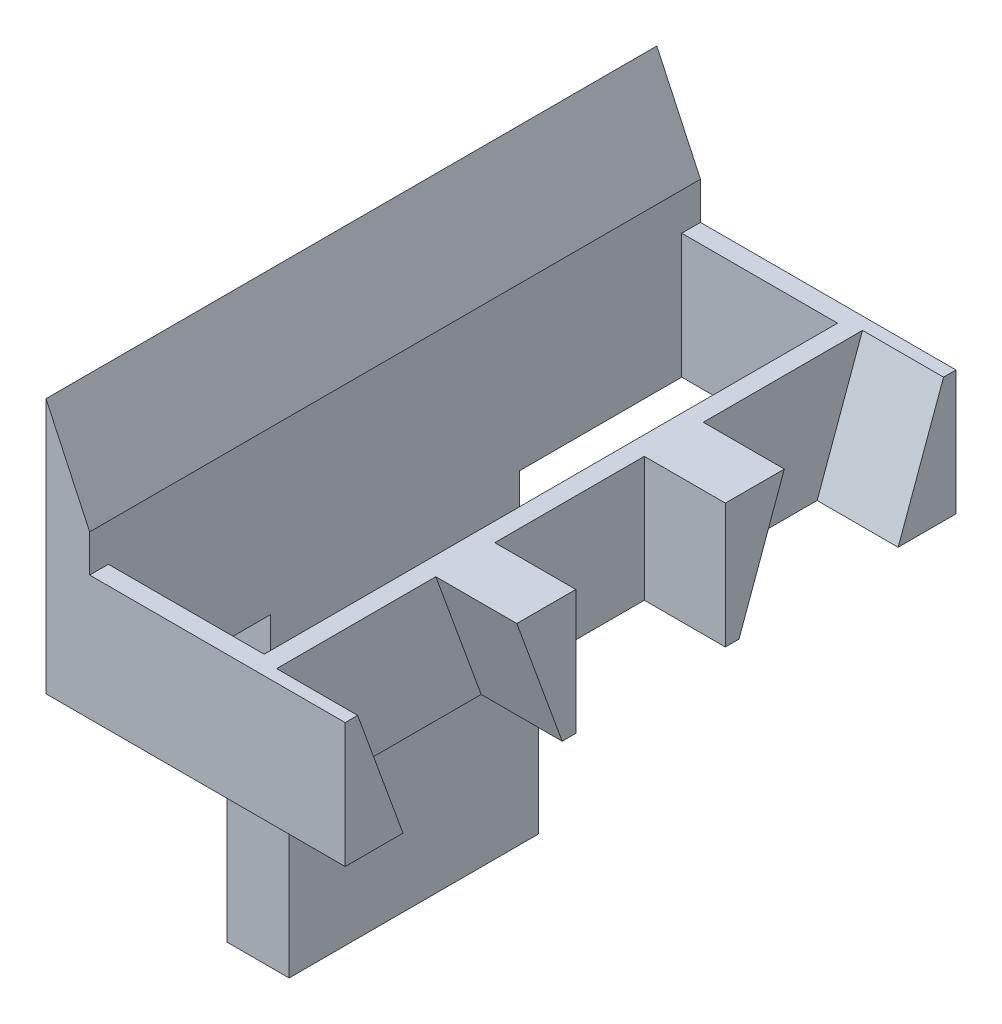
ISO-10303-21;
HEADER;
FILE_DESCRIPTION(('STEP AP214'),'2;1');
FILE_NAME('part.step','',(''),(''),'','','');
FILE_SCHEMA(('AUTOMOTIVE_DESIGN { 1 0 10303 214 1 1 1 1 }'));
ENDSEC;
DATA;
#1=APPLICATION_CONTEXT('core data for automotive mechanical design processes');
#2=APPLICATION_PROTOCOL_DEFINITION('international standard','automotive_design',2000,#1);
#3=PRODUCT_CONTEXT('',#1,'mechanical');
#4=PRODUCT('Part','Part','',(#3));
#5=PRODUCT_RELATED_PRODUCT_CATEGORY('part','',(#4));
#6=PRODUCT_DEFINITION_FORMATION('','',#4);
#7=PRODUCT_DEFINITION_CONTEXT('part definition',#1,'design');
#8=PRODUCT_DEFINITION('design','',#6,#7);
#9=PRODUCT_DEFINITION_SHAPE('','',#8);
#10=(LENGTH_UNIT() NAMED_UNIT(*) SI_UNIT(.MILLI.,.METRE.));
#11=(NAMED_UNIT(*) PLANE_ANGLE_UNIT() SI_UNIT($,.RADIAN.));
#12=(NAMED_UNIT(*) SI_UNIT($,.STERADIAN.) SOLID_ANGLE_UNIT());
#13=UNCERTAINTY_MEASURE_WITH_UNIT(LENGTH_MEASURE(1.E-05),#10,'distance_accuracy_value','');
#14=(GEOMETRIC_REPRESENTATION_CONTEXT(3) GLOBAL_UNCERTAINTY_ASSIGNED_CONTEXT((#13)) GLOBAL_UNIT_ASSIGNED_CONTEXT((#10,
#11,#12)) REPRESENTATION_CONTEXT('',''));
#15=CARTESIAN_POINT('',(0.,0.,0.));
#16=DIRECTION('',(0.,0.,1.));
#17=DIRECTION('',(1.,0.,0.));
#18=AXIS2_PLACEMENT_3D('',#15,#16,#17);
#19=CARTESIAN_POINT('',(0.,0.,49.));
#20=DIRECTION('',(-1.,0.,0.));
#21=DIRECTION('',(0.,-1.,0.));
#22=AXIS2_PLACEMENT_3D('',#19,#20,#21);
#23=PLANE('',#22);
#24=DIRECTION('',(0.,0.,1.));
#25=VECTOR('',#24,1.);
#26=CARTESIAN_POINT('',(0.,16.5,34.5));
#27=LINE('',#26,#25);
#28=CARTESIAN_POINT('',(0.,16.5,14.5));
#29=VERTEX_POINT('',#28);
#30=CARTESIAN_POINT('',(0.,16.5,34.5));
#31=VERTEX_POINT('',#30);
#32=EDGE_CURVE('E251',#29,#31,#27,.T.);
#33=ORIENTED_EDGE('',*,*,#32,.F.);
#34=DIRECTION('',(0.,-1.,0.));
#35=VECTOR('',#34,1.);
#36=CARTESIAN_POINT('',(0.,4.5,14.5));
#37=LINE('',#36,#35);
#38=CARTESIAN_POINT('',(0.,28.9942257782166,14.5));
#39=VERTEX_POINT('',#38);
#40=EDGE_CURVE('E401',#39,#29,#37,.T.);
#41=ORIENTED_EDGE('',*,*,#40,.F.);
#42=DIRECTION('',(0.,0.,1.));
#43=VECTOR('',#42,1.);
#44=CARTESIAN_POINT('',(0.,28.9942257782166,0.));
#45=LINE('',#44,#43);
#46=CARTESIAN_POINT('',(0.,28.9942257782166,1.5));
#47=VERTEX_POINT('',#46);
#48=EDGE_CURVE('E373',#47,#39,#45,.T.);
#49=ORIENTED_EDGE('',*,*,#48,.F.);
#50=DIRECTION('',(0.,-1.,0.));
#51=VECTOR('',#50,1.);
#52=CARTESIAN_POINT('',(0.,38.9942257782166,1.5));
#53=LINE('',#52,#51);
#54=CARTESIAN_POINT('',(0.,38.9942257782166,1.5));
#55=VERTEX_POINT('',#54);
#56=EDGE_CURVE('E377',#55,#47,#53,.T.);
#57=ORIENTED_EDGE('',*,*,#56,.F.);
#58=DIRECTION('',(0.,0.,-1.));
#59=VECTOR('',#58,1.);
#60=CARTESIAN_POINT('',(0.,38.9942257782166,1.5));
#61=LINE('',#60,#59);
#62=CARTESIAN_POINT('',(0.,38.9942257782166,0.));
#63=VERTEX_POINT('',#62);
#64=EDGE_CURVE('E344',#55,#63,#61,.T.);
#65=ORIENTED_EDGE('',*,*,#64,.T.);
#66=DIRECTION('',(0.,1.,0.));
#67=VECTOR('',#66,1.);
#68=CARTESIAN_POINT('',(0.,0.,0.));
#69=LINE('',#68,#67);
#70=CARTESIAN_POINT('',(0.,41.9942257782166,0.));
#71=VERTEX_POINT('',#70);
#72=EDGE_CURVE('E423',#63,#71,#69,.T.);
#73=ORIENTED_EDGE('',*,*,#72,.T.);
#74=DIRECTION('',(0.,0.,-1.));
#75=VECTOR('',#74,1.);
#76=CARTESIAN_POINT('',(0.,41.9942257782166,49.));
#77=LINE('',#76,#75);
#78=CARTESIAN_POINT('',(0.,41.9942257782166,49.));
#79=VERTEX_POINT('',#78);
#80=EDGE_CURVE('E47',#79,#71,#77,.T.);
#81=ORIENTED_EDGE('',*,*,#80,.F.);
#82=DIRECTION('',(0.,1.,0.));
#83=VECTOR('',#82,1.);
#84=CARTESIAN_POINT('',(0.,0.,49.));
#85=LINE('',#84,#83);
#86=CARTESIAN_POINT('',(0.,38.9942257782166,49.));
#87=VERTEX_POINT('',#86);
#88=EDGE_CURVE('E426',#87,#79,#85,.T.);
#89=ORIENTED_EDGE('',*,*,#88,.F.);
#90=DIRECTION('',(0.,0.,-1.));
#91=VECTOR('',#90,1.);
#92=CARTESIAN_POINT('',(0.,38.9942257782166,47.5));
#93=LINE('',#92,#91);
#94=CARTESIAN_POINT('',(0.,38.9942257782166,47.5));
#95=VERTEX_POINT('',#94);
#96=EDGE_CURVE('E331',#87,#95,#93,.T.);
#97=ORIENTED_EDGE('',*,*,#96,.T.);
#98=DIRECTION('',(0.,-1.,0.));
#99=VECTOR('',#98,1.);
#100=CARTESIAN_POINT('',(0.,38.9942257782166,47.5));
#101=LINE('',#100,#99);
#102=CARTESIAN_POINT('',(0.,28.9942257782166,47.5));
#103=VERTEX_POINT('',#102);
#104=EDGE_CURVE('E358',#95,#103,#101,.T.);
#105=ORIENTED_EDGE('',*,*,#104,.T.);
#106=DIRECTION('',(0.,0.,1.));
#107=VECTOR('',#106,1.);
#108=CARTESIAN_POINT('',(0.,28.9942257782166,49.));
#109=LINE('',#108,#107);
#110=CARTESIAN_POINT('',(0.,28.9942257782166,34.5));
#111=VERTEX_POINT('',#110);
#112=EDGE_CURVE('E390',#111,#103,#109,.T.);
#113=ORIENTED_EDGE('',*,*,#112,.F.);
#114=DIRECTION('',(0.,1.,0.));
#115=VECTOR('',#114,1.);
#116=CARTESIAN_POINT('',(0.,4.5,34.5));
#117=LINE('',#116,#115);
#118=EDGE_CURVE('E404',#31,#111,#117,.T.);
#119=ORIENTED_EDGE('',*,*,#118,.F.);
#120=EDGE_LOOP('',(#33,#41,#49,#57,#65,#73,#81,#89,#97,#105,#113,#119));
#121=FACE_BOUND('',#120,.T.);
#122=ADVANCED_FACE('F39',(#121),#23,.F.);
#123=CARTESIAN_POINT('',(20.5,38.9942257782166,49.));
#124=DIRECTION('',(1.,0.,0.));
#125=DIRECTION('',(0.,0.,-1.));
#126=AXIS2_PLACEMENT_3D('',#123,#124,#125);
#127=PLANE('',#126);
#128=DIRECTION('',(0.,0.939692620785908,0.342020143325669));
#129=VECTOR('',#128,1.);
#130=CARTESIAN_POINT('',(20.5,38.9942257782166,35.2298667302891));
#131=LINE('',#130,#129);
#132=CARTESIAN_POINT('',(20.5,28.9942257782166,31.590164387627));
#133=VERTEX_POINT('',#132);
#134=CARTESIAN_POINT('',(20.5,38.9942257782166,35.2298667302891));
#135=VERTEX_POINT('',#134);
#136=EDGE_CURVE('E265',#133,#135,#131,.T.);
#137=ORIENTED_EDGE('',*,*,#136,.F.);
#138=DIRECTION('',(0.,0.,1.));
#139=VECTOR('',#138,1.);
#140=CARTESIAN_POINT('',(20.5,28.9942257782166,49.));
#141=LINE('',#140,#139);
#142=CARTESIAN_POINT('',(20.5,28.9942257782166,30.5));
#143=VERTEX_POINT('',#142);
#144=EDGE_CURVE('E543',#143,#133,#141,.T.);
#145=ORIENTED_EDGE('',*,*,#144,.F.);
#146=DIRECTION('',(0.,-1.,0.));
#147=VECTOR('',#146,1.);
#148=CARTESIAN_POINT('',(20.5,28.9942257782166,30.5));
#149=LINE('',#148,#147);
#150=CARTESIAN_POINT('',(20.5,38.9942257782166,30.5));
#151=VERTEX_POINT('',#150);
#152=EDGE_CURVE('E298',#151,#143,#149,.T.);
#153=ORIENTED_EDGE('',*,*,#152,.F.);
#154=DIRECTION('',(0.,0.,1.));
#155=VECTOR('',#154,1.);
#156=CARTESIAN_POINT('',(20.5,38.9942257782166,49.));
#157=LINE('',#156,#155);
#158=EDGE_CURVE('E549',#151,#135,#157,.T.);
#159=ORIENTED_EDGE('',*,*,#158,.T.);
#160=EDGE_LOOP('',(#137,#145,#153,#159));
#161=FACE_BOUND('',#160,.T.);
#162=ADVANCED_FACE('F491',(#161),#127,.T.);
#163=DIRECTION('',(0.,1.,0.));
#164=VECTOR('',#163,1.);
#165=CARTESIAN_POINT('',(20.5,28.9942257782166,18.5));
#166=LINE('',#165,#164);
#167=CARTESIAN_POINT('',(20.5,28.9942257782166,18.5));
#168=VERTEX_POINT('',#167);
#169=CARTESIAN_POINT('',(20.5,38.9942257782166,18.5));
#170=VERTEX_POINT('',#169);
#171=EDGE_CURVE('E274',#168,#170,#166,.T.);
#172=ORIENTED_EDGE('',*,*,#171,.F.);
#173=CARTESIAN_POINT('',(20.5,28.9942257782166,17.409835612373));
#174=VERTEX_POINT('',#173);
#175=EDGE_CURVE('E369',#174,#168,#141,.T.);
#176=ORIENTED_EDGE('',*,*,#175,.F.);
#177=DIRECTION('',(0.,-0.939692620785908,0.342020143325669));
#178=VECTOR('',#177,1.);
#179=CARTESIAN_POINT('',(20.5,38.9942257782166,13.7701332697109));
#180=LINE('',#179,#178);
#181=CARTESIAN_POINT('',(20.5,38.9942257782166,13.7701332697109));
#182=VERTEX_POINT('',#181);
#183=EDGE_CURVE('E297',#182,#174,#180,.T.);
#184=ORIENTED_EDGE('',*,*,#183,.F.);
#185=EDGE_CURVE('E355',#182,#170,#157,.T.);
#186=ORIENTED_EDGE('',*,*,#185,.T.);
#187=EDGE_LOOP('',(#172,#176,#184,#186));
#188=FACE_BOUND('',#187,.T.);
#189=ADVANCED_FACE('F496',(#188),#127,.T.);
#190=DIRECTION('',(0.,-0.939692620785908,-0.34202014332567));
#191=VECTOR('',#190,1.);
#192=CARTESIAN_POINT('',(20.5,38.9942257782166,48.));
#193=LINE('',#192,#191);
#194=CARTESIAN_POINT('',(20.5,38.9942257782166,48.));
#195=VERTEX_POINT('',#194);
#196=CARTESIAN_POINT('',(20.5,28.9942257782166,44.360297657338));
#197=VERTEX_POINT('',#196);
#198=EDGE_CURVE('E272',#195,#197,#193,.T.);
#199=ORIENTED_EDGE('',*,*,#198,.F.);
#200=CARTESIAN_POINT('',(20.5,38.9942257782166,49.));
#201=VERTEX_POINT('',#200);
#202=EDGE_CURVE('E350',#195,#201,#157,.T.);
#203=ORIENTED_EDGE('',*,*,#202,.T.);
#204=DIRECTION('',(0.,-1.,0.));
#205=VECTOR('',#204,1.);
#206=CARTESIAN_POINT('',(20.5,38.9942257782166,49.));
#207=LINE('',#206,#205);
#208=CARTESIAN_POINT('',(20.5,28.9942257782166,49.));
#209=VERTEX_POINT('',#208);
#210=EDGE_CURVE('E370',#201,#209,#207,.T.);
#211=ORIENTED_EDGE('',*,*,#210,.T.);
#212=EDGE_CURVE('E366',#197,#209,#141,.T.);
#213=ORIENTED_EDGE('',*,*,#212,.F.);
#214=EDGE_LOOP('',(#199,#203,#211,#213));
#215=FACE_BOUND('',#214,.T.);
#216=ADVANCED_FACE('F506',(#215),#127,.T.);
#217=CARTESIAN_POINT('',(0.,41.9942257782166,49.));
#218=DIRECTION('',(-0.906307787036649,-0.422618261740701,0.));
#219=DIRECTION('',(0.422618261740701,-0.906307787036649,0.));
#220=AXIS2_PLACEMENT_3D('',#217,#218,#219);
#221=PLANE('',#220);
#222=DIRECTION('',(-0.422618261740701,0.906307787036649,0.));
#223=VECTOR('',#222,1.);
#224=CARTESIAN_POINT('',(0.,41.9942257782166,0.));
#225=LINE('',#224,#223);
#226=CARTESIAN_POINT('',(-3.5,49.5,0.));
#227=VERTEX_POINT('',#226);
#228=EDGE_CURVE('E411',#71,#227,#225,.T.);
#229=ORIENTED_EDGE('',*,*,#228,.T.);
#230=DIRECTION('',(0.,0.,-1.));
#231=VECTOR('',#230,1.);
#232=CARTESIAN_POINT('',(-3.5,49.5,49.));
#233=LINE('',#232,#231);
#234=CARTESIAN_POINT('',(-3.5,49.5,49.));
#235=VERTEX_POINT('',#234);
#236=EDGE_CURVE('E11',#235,#227,#233,.T.);
#237=ORIENTED_EDGE('',*,*,#236,.F.);
#238=DIRECTION('',(-0.422618261740701,0.906307787036649,0.));
#239=VECTOR('',#238,1.);
#240=CARTESIAN_POINT('',(0.,41.9942257782166,49.));
#241=LINE('',#240,#239);
#242=EDGE_CURVE('E419',#79,#235,#241,.T.);
#243=ORIENTED_EDGE('',*,*,#242,.F.);
#244=ORIENTED_EDGE('',*,*,#80,.T.);
#245=EDGE_LOOP('',(#229,#237,#243,#244));
#246=FACE_BOUND('',#245,.T.);
#247=ADVANCED_FACE('F41',(#246),#221,.F.);
#248=CARTESIAN_POINT('',(-3.5,49.5,49.));
#249=DIRECTION('',(1.,0.,0.));
#250=DIRECTION('',(0.,1.,0.));
#251=AXIS2_PLACEMENT_3D('',#248,#249,#250);
#252=PLANE('',#251);
#253=DIRECTION('',(0.,1.,0.));
#254=VECTOR('',#253,1.);
#255=CARTESIAN_POINT('',(-3.5,4.5,34.5));
#256=LINE('',#255,#254);
#257=CARTESIAN_POINT('',(-3.5,4.5,34.5));
#258=VERTEX_POINT('',#257);
#259=CARTESIAN_POINT('',(-3.5,28.9942257782166,34.5));
#260=VERTEX_POINT('',#259);
#261=EDGE_CURVE('E233',#258,#260,#256,.T.);
#262=ORIENTED_EDGE('',*,*,#261,.T.);
#263=DIRECTION('',(0.,0.,1.));
#264=VECTOR('',#263,1.);
#265=CARTESIAN_POINT('',(-3.5,28.9942257782166,49.));
#266=LINE('',#265,#264);
#267=CARTESIAN_POINT('',(-3.5,28.9942257782166,49.));
#268=VERTEX_POINT('',#267);
#269=EDGE_CURVE('E396',#260,#268,#266,.T.);
#270=ORIENTED_EDGE('',*,*,#269,.T.);
#271=DIRECTION('',(0.,-1.,0.));
#272=VECTOR('',#271,1.);
#273=CARTESIAN_POINT('',(-3.5,49.5,49.));
#274=LINE('',#273,#272);
#275=EDGE_CURVE('E422',#235,#268,#274,.T.);
#276=ORIENTED_EDGE('',*,*,#275,.F.);
#277=ORIENTED_EDGE('',*,*,#236,.T.);
#278=DIRECTION('',(0.,-1.,0.));
#279=VECTOR('',#278,1.);
#280=CARTESIAN_POINT('',(-3.5,49.5,0.));
#281=LINE('',#280,#279);
#282=CARTESIAN_POINT('',(-3.5,28.9942257782166,0.));
#283=VERTEX_POINT('',#282);
#284=EDGE_CURVE('E430',#227,#283,#281,.T.);
#285=ORIENTED_EDGE('',*,*,#284,.T.);
#286=DIRECTION('',(0.,0.,1.));
#287=VECTOR('',#286,1.);
#288=CARTESIAN_POINT('',(-3.5,28.9942257782166,0.));
#289=LINE('',#288,#287);
#290=CARTESIAN_POINT('',(-3.5,28.9942257782166,14.5));
#291=VERTEX_POINT('',#290);
#292=EDGE_CURVE('E386',#283,#291,#289,.T.);
#293=ORIENTED_EDGE('',*,*,#292,.T.);
#294=DIRECTION('',(0.,-1.,0.));
#295=VECTOR('',#294,1.);
#296=CARTESIAN_POINT('',(-3.5,4.5,14.5));
#297=LINE('',#296,#295);
#298=CARTESIAN_POINT('',(-3.5,4.5,14.5));
#299=VERTEX_POINT('',#298);
#300=EDGE_CURVE('E389',#291,#299,#297,.T.);
#301=ORIENTED_EDGE('',*,*,#300,.T.);
#302=DIRECTION('',(0.,0.,1.));
#303=VECTOR('',#302,1.);
#304=CARTESIAN_POINT('',(-3.5,4.5,34.5));
#305=LINE('',#304,#303);
#306=EDGE_CURVE('E393',#299,#258,#305,.T.);
#307=ORIENTED_EDGE('',*,*,#306,.T.);
#308=EDGE_LOOP('',(#262,#270,#276,#277,#285,#293,#301,#307));
#309=FACE_BOUND('',#308,.T.);
#310=ADVANCED_FACE('F446',(#309),#252,.F.);
#311=CARTESIAN_POINT('',(0.,0.,49.));
#312=DIRECTION('',(0.,0.,-1.));
#313=DIRECTION('',(-1.,0.,0.));
#314=AXIS2_PLACEMENT_3D('',#311,#312,#313);
#315=PLANE('',#314);
#316=ORIENTED_EDGE('',*,*,#275,.T.);
#317=DIRECTION('',(1.,0.,0.));
#318=VECTOR('',#317,1.);
#319=CARTESIAN_POINT('',(-3.5,28.9942257782166,49.));
#320=LINE('',#319,#318);
#321=EDGE_CURVE('E408',#268,#209,#320,.T.);
#322=ORIENTED_EDGE('',*,*,#321,.T.);
#323=ORIENTED_EDGE('',*,*,#210,.F.);
#324=DIRECTION('',(-1.,0.,0.));
#325=VECTOR('',#324,1.);
#326=CARTESIAN_POINT('',(0.,38.9942257782166,49.));
#327=LINE('',#326,#325);
#328=EDGE_CURVE('E354',#201,#87,#327,.T.);
#329=ORIENTED_EDGE('',*,*,#328,.T.);
#330=ORIENTED_EDGE('',*,*,#88,.T.);
#331=ORIENTED_EDGE('',*,*,#242,.T.);
#332=EDGE_LOOP('',(#316,#322,#323,#329,#330,#331));
#333=FACE_BOUND('',#332,.T.);
#334=ADVANCED_FACE('F449',(#333),#315,.F.);
#335=CARTESIAN_POINT('',(0.,0.,0.));
#336=DIRECTION('',(0.,0.,-1.));
#337=DIRECTION('',(-1.,0.,0.));
#338=AXIS2_PLACEMENT_3D('',#335,#336,#337);
#339=PLANE('',#338);
#340=DIRECTION('',(1.,0.,0.));
#341=VECTOR('',#340,1.);
#342=CARTESIAN_POINT('',(-3.5,28.9942257782166,0.));
#343=LINE('',#342,#341);
#344=CARTESIAN_POINT('',(20.5,28.9942257782166,0.));
#345=VERTEX_POINT('',#344);
#346=EDGE_CURVE('E399',#283,#345,#343,.T.);
#347=ORIENTED_EDGE('',*,*,#346,.F.);
#348=ORIENTED_EDGE('',*,*,#284,.F.);
#349=ORIENTED_EDGE('',*,*,#228,.F.);
#350=ORIENTED_EDGE('',*,*,#72,.F.);
#351=DIRECTION('',(1.,0.,0.));
#352=VECTOR('',#351,1.);
#353=CARTESIAN_POINT('',(20.5,38.9942257782166,0.));
#354=LINE('',#353,#352);
#355=CARTESIAN_POINT('',(20.5,38.9942257782166,0.));
#356=VERTEX_POINT('',#355);
#357=EDGE_CURVE('E347',#63,#356,#354,.T.);
#358=ORIENTED_EDGE('',*,*,#357,.T.);
#359=DIRECTION('',(0.,-1.,0.));
#360=VECTOR('',#359,1.);
#361=CARTESIAN_POINT('',(20.5,38.9942257782166,0.));
#362=LINE('',#361,#360);
#363=EDGE_CURVE('E374',#356,#345,#362,.T.);
#364=ORIENTED_EDGE('',*,*,#363,.T.);
#365=EDGE_LOOP('',(#347,#348,#349,#350,#358,#364));
#366=FACE_BOUND('',#365,.T.);
#367=ADVANCED_FACE('F444',(#366),#339,.T.);
#368=CARTESIAN_POINT('',(-3.5,28.9942257782166,49.));
#369=DIRECTION('',(0.,1.,0.));
#370=DIRECTION('',(0.,0.,1.));
#371=AXIS2_PLACEMENT_3D('',#368,#369,#370);
#372=PLANE('',#371);
#373=ORIENTED_EDGE('',*,*,#144,.T.);
#374=DIRECTION('',(1.,0.,0.));
#375=VECTOR('',#374,1.);
#376=CARTESIAN_POINT('',(14.,28.9942257782166,31.590164387627));
#377=LINE('',#376,#375);
#378=CARTESIAN_POINT('',(14.,28.9942257782166,31.590164387627));
#379=VERTEX_POINT('',#378);
#380=EDGE_CURVE('E280',#379,#133,#377,.T.);
#381=ORIENTED_EDGE('',*,*,#380,.F.);
#382=DIRECTION('',(0.,0.,-1.));
#383=VECTOR('',#382,1.);
#384=CARTESIAN_POINT('',(14.,28.9942257782166,31.590164387627));
#385=LINE('',#384,#383);
#386=CARTESIAN_POINT('',(14.,28.9942257782166,44.360297657338));
#387=VERTEX_POINT('',#386);
#388=EDGE_CURVE('E268',#387,#379,#385,.T.);
#389=ORIENTED_EDGE('',*,*,#388,.F.);
#390=DIRECTION('',(1.,0.,0.));
#391=VECTOR('',#390,1.);
#392=CARTESIAN_POINT('',(14.,28.9942257782166,44.360297657338));
#393=LINE('',#392,#391);
#394=EDGE_CURVE('E282',#387,#197,#393,.T.);
#395=ORIENTED_EDGE('',*,*,#394,.T.);
#396=ORIENTED_EDGE('',*,*,#212,.T.);
#397=ORIENTED_EDGE('',*,*,#321,.F.);
#398=ORIENTED_EDGE('',*,*,#269,.F.);
#399=DIRECTION('',(1.,0.,0.));
#400=VECTOR('',#399,1.);
#401=CARTESIAN_POINT('',(-3.5,28.9942257782166,34.5));
#402=LINE('',#401,#400);
#403=EDGE_CURVE('E237',#260,#111,#402,.T.);
#404=ORIENTED_EDGE('',*,*,#403,.T.);
#405=ORIENTED_EDGE('',*,*,#112,.T.);
#406=DIRECTION('',(1.,0.,0.));
#407=VECTOR('',#406,1.);
#408=CARTESIAN_POINT('',(12.5,28.9942257782166,47.5));
#409=LINE('',#408,#407);
#410=CARTESIAN_POINT('',(12.5,28.9942257782166,47.5));
#411=VERTEX_POINT('',#410);
#412=EDGE_CURVE('E279',#103,#411,#409,.T.);
#413=ORIENTED_EDGE('',*,*,#412,.T.);
#414=DIRECTION('',(0.,0.,-1.));
#415=VECTOR('',#414,1.);
#416=CARTESIAN_POINT('',(12.5,28.9942257782166,47.5));
#417=LINE('',#416,#415);
#418=CARTESIAN_POINT('',(12.5,28.9942257782166,1.5));
#419=VERTEX_POINT('',#418);
#420=EDGE_CURVE('E361',#411,#419,#417,.T.);
#421=ORIENTED_EDGE('',*,*,#420,.T.);
#422=DIRECTION('',(-1.,0.,0.));
#423=VECTOR('',#422,1.);
#424=CARTESIAN_POINT('',(12.5,28.9942257782166,1.5));
#425=LINE('',#424,#423);
#426=EDGE_CURVE('E364',#419,#47,#425,.T.);
#427=ORIENTED_EDGE('',*,*,#426,.T.);
#428=ORIENTED_EDGE('',*,*,#48,.T.);
#429=DIRECTION('',(1.,0.,0.));
#430=VECTOR('',#429,1.);
#431=CARTESIAN_POINT('',(-3.5,28.9942257782166,14.5));
#432=LINE('',#431,#430);
#433=EDGE_CURVE('E415',#291,#39,#432,.T.);
#434=ORIENTED_EDGE('',*,*,#433,.F.);
#435=ORIENTED_EDGE('',*,*,#292,.F.);
#436=ORIENTED_EDGE('',*,*,#346,.T.);
#437=CARTESIAN_POINT('',(20.5,28.9942257782166,4.63970234266202));
#438=VERTEX_POINT('',#437);
#439=EDGE_CURVE('E335',#345,#438,#141,.T.);
#440=ORIENTED_EDGE('',*,*,#439,.T.);
#441=DIRECTION('',(1.,0.,0.));
#442=VECTOR('',#441,1.);
#443=CARTESIAN_POINT('',(14.,28.9942257782166,4.63970234266202));
#444=LINE('',#443,#442);
#445=CARTESIAN_POINT('',(14.,28.9942257782166,4.63970234266202));
#446=VERTEX_POINT('',#445);
#447=EDGE_CURVE('E312',#446,#438,#444,.T.);
#448=ORIENTED_EDGE('',*,*,#447,.F.);
#449=DIRECTION('',(0.,0.,-1.));
#450=VECTOR('',#449,1.);
#451=CARTESIAN_POINT('',(14.,28.9942257782166,17.409835612373));
#452=LINE('',#451,#450);
#453=CARTESIAN_POINT('',(14.,28.9942257782166,17.409835612373));
#454=VERTEX_POINT('',#453);
#455=EDGE_CURVE('E326',#454,#446,#452,.T.);
#456=ORIENTED_EDGE('',*,*,#455,.F.);
#457=DIRECTION('',(1.,0.,0.));
#458=VECTOR('',#457,1.);
#459=CARTESIAN_POINT('',(14.,28.9942257782166,17.409835612373));
#460=LINE('',#459,#458);
#461=EDGE_CURVE('E308',#454,#174,#460,.T.);
#462=ORIENTED_EDGE('',*,*,#461,.T.);
#463=ORIENTED_EDGE('',*,*,#175,.T.);
#464=DIRECTION('',(1.,0.,0.));
#465=VECTOR('',#464,1.);
#466=CARTESIAN_POINT('',(14.,28.9942257782166,18.5));
#467=LINE('',#466,#465);
#468=CARTESIAN_POINT('',(14.,28.9942257782166,18.5));
#469=VERTEX_POINT('',#468);
#470=EDGE_CURVE('E295',#469,#168,#467,.T.);
#471=ORIENTED_EDGE('',*,*,#470,.F.);
#472=DIRECTION('',(0.,0.,-1.));
#473=VECTOR('',#472,1.);
#474=CARTESIAN_POINT('',(14.,28.9942257782166,30.5));
#475=LINE('',#474,#473);
#476=CARTESIAN_POINT('',(14.,28.9942257782166,30.5));
#477=VERTEX_POINT('',#476);
#478=EDGE_CURVE('E289',#477,#469,#475,.T.);
#479=ORIENTED_EDGE('',*,*,#478,.F.);
#480=DIRECTION('',(1.,0.,0.));
#481=VECTOR('',#480,1.);
#482=CARTESIAN_POINT('',(14.,28.9942257782166,30.5));
#483=LINE('',#482,#481);
#484=EDGE_CURVE('E292',#477,#143,#483,.T.);
#485=ORIENTED_EDGE('',*,*,#484,.T.);
#486=EDGE_LOOP('',(#373,#381,#389,#395,#396,#397,#398,#404,#405,#413,#421,#427,#428,#434,#435,
#436,#440,#448,#456,#462,#463,#471,#479,#485));
#487=FACE_BOUND('',#486,.T.);
#488=ADVANCED_FACE('F465',(#487),#372,.F.);
#489=CARTESIAN_POINT('',(-3.5,4.5,34.5));
#490=DIRECTION('',(0.,0.,-1.));
#491=DIRECTION('',(-1.,0.,0.));
#492=AXIS2_PLACEMENT_3D('',#489,#490,#491);
#493=PLANE('',#492);
#494=DIRECTION('',(1.,0.,0.));
#495=VECTOR('',#494,1.);
#496=CARTESIAN_POINT('',(-3.5,4.5,34.5));
#497=LINE('',#496,#495);
#498=CARTESIAN_POINT('',(1.5,4.5,34.5));
#499=VERTEX_POINT('',#498);
#500=EDGE_CURVE('E226',#258,#499,#497,.T.);
#501=ORIENTED_EDGE('',*,*,#500,.T.);
#502=DIRECTION('',(0.,-1.,0.));
#503=VECTOR('',#502,1.);
#504=CARTESIAN_POINT('',(1.5,4.5,34.5));
#505=LINE('',#504,#503);
#506=CARTESIAN_POINT('',(1.5,16.5,34.5));
#507=VERTEX_POINT('',#506);
#508=EDGE_CURVE('E231',#507,#499,#505,.T.);
#509=ORIENTED_EDGE('',*,*,#508,.F.);
#510=DIRECTION('',(-1.,0.,0.));
#511=VECTOR('',#510,1.);
#512=CARTESIAN_POINT('',(1.5,16.5,34.5));
#513=LINE('',#512,#511);
#514=EDGE_CURVE('E256',#507,#31,#513,.T.);
#515=ORIENTED_EDGE('',*,*,#514,.T.);
#516=ORIENTED_EDGE('',*,*,#118,.T.);
#517=ORIENTED_EDGE('',*,*,#403,.F.);
#518=ORIENTED_EDGE('',*,*,#261,.F.);
#519=EDGE_LOOP('',(#501,#509,#515,#516,#517,#518));
#520=FACE_BOUND('',#519,.T.);
#521=ADVANCED_FACE('F228',(#520),#493,.F.);
#522=CARTESIAN_POINT('',(-3.5,4.5,34.5));
#523=DIRECTION('',(0.,1.,0.));
#524=DIRECTION('',(0.,0.,1.));
#525=AXIS2_PLACEMENT_3D('',#522,#523,#524);
#526=PLANE('',#525);
#527=DIRECTION('',(1.,0.,0.));
#528=VECTOR('',#527,1.);
#529=CARTESIAN_POINT('',(-3.5,4.5,14.5));
#530=LINE('',#529,#528);
#531=CARTESIAN_POINT('',(1.5,4.5,14.5));
#532=VERTEX_POINT('',#531);
#533=EDGE_CURVE('E238',#299,#532,#530,.T.);
#534=ORIENTED_EDGE('',*,*,#533,.T.);
#535=DIRECTION('',(0.,0.,-1.));
#536=VECTOR('',#535,1.);
#537=CARTESIAN_POINT('',(1.5,4.5,34.5));
#538=LINE('',#537,#536);
#539=EDGE_CURVE('E241',#499,#532,#538,.T.);
#540=ORIENTED_EDGE('',*,*,#539,.F.);
#541=ORIENTED_EDGE('',*,*,#500,.F.);
#542=ORIENTED_EDGE('',*,*,#306,.F.);
#543=EDGE_LOOP('',(#534,#540,#541,#542));
#544=FACE_BOUND('',#543,.T.);
#545=ADVANCED_FACE('F242',(#544),#526,.F.);
#546=CARTESIAN_POINT('',(-3.5,4.5,14.5));
#547=DIRECTION('',(0.,0.,1.));
#548=DIRECTION('',(0.,-1.,0.));
#549=AXIS2_PLACEMENT_3D('',#546,#547,#548);
#550=PLANE('',#549);
#551=ORIENTED_EDGE('',*,*,#40,.T.);
#552=DIRECTION('',(-1.,0.,0.));
#553=VECTOR('',#552,1.);
#554=CARTESIAN_POINT('',(1.5,16.5,14.5));
#555=LINE('',#554,#553);
#556=CARTESIAN_POINT('',(1.5,16.5,14.5));
#557=VERTEX_POINT('',#556);
#558=EDGE_CURVE('E259',#557,#29,#555,.T.);
#559=ORIENTED_EDGE('',*,*,#558,.F.);
#560=DIRECTION('',(0.,1.,0.));
#561=VECTOR('',#560,1.);
#562=CARTESIAN_POINT('',(1.5,4.5,14.5));
#563=LINE('',#562,#561);
#564=EDGE_CURVE('E245',#532,#557,#563,.T.);
#565=ORIENTED_EDGE('',*,*,#564,.F.);
#566=ORIENTED_EDGE('',*,*,#533,.F.);
#567=ORIENTED_EDGE('',*,*,#300,.F.);
#568=ORIENTED_EDGE('',*,*,#433,.T.);
#569=EDGE_LOOP('',(#551,#559,#565,#566,#567,#568));
#570=FACE_BOUND('',#569,.T.);
#571=ADVANCED_FACE('F472',(#570),#550,.F.);
#572=DIRECTION('',(0.,0.939692620785908,-0.34202014332567));
#573=VECTOR('',#572,1.);
#574=CARTESIAN_POINT('',(20.5,38.9942257782166,0.99999999999999));
#575=LINE('',#574,#573);
#576=CARTESIAN_POINT('',(20.5,38.9942257782166,0.99999999999999));
#577=VERTEX_POINT('',#576);
#578=EDGE_CURVE('E318',#438,#577,#575,.T.);
#579=ORIENTED_EDGE('',*,*,#578,.F.);
#580=ORIENTED_EDGE('',*,*,#439,.F.);
#581=ORIENTED_EDGE('',*,*,#363,.F.);
#582=EDGE_CURVE('E351',#356,#577,#157,.T.);
#583=ORIENTED_EDGE('',*,*,#582,.T.);
#584=EDGE_LOOP('',(#579,#580,#581,#583));
#585=FACE_BOUND('',#584,.T.);
#586=ADVANCED_FACE('F488',(#585),#127,.T.);
#587=CARTESIAN_POINT('',(12.5,38.9942257782166,1.5));
#588=DIRECTION('',(0.,0.,1.));
#589=DIRECTION('',(1.,0.,0.));
#590=AXIS2_PLACEMENT_3D('',#587,#588,#589);
#591=PLANE('',#590);
#592=ORIENTED_EDGE('',*,*,#426,.F.);
#593=DIRECTION('',(0.,-1.,0.));
#594=VECTOR('',#593,1.);
#595=CARTESIAN_POINT('',(12.5,38.9942257782166,1.5));
#596=LINE('',#595,#594);
#597=CARTESIAN_POINT('',(12.5,38.9942257782166,1.5));
#598=VERTEX_POINT('',#597);
#599=EDGE_CURVE('E380',#598,#419,#596,.T.);
#600=ORIENTED_EDGE('',*,*,#599,.F.);
#601=DIRECTION('',(-1.,0.,0.));
#602=VECTOR('',#601,1.);
#603=CARTESIAN_POINT('',(12.5,38.9942257782166,1.5));
#604=LINE('',#603,#602);
#605=EDGE_CURVE('E341',#598,#55,#604,.T.);
#606=ORIENTED_EDGE('',*,*,#605,.T.);
#607=ORIENTED_EDGE('',*,*,#56,.T.);
#608=EDGE_LOOP('',(#592,#600,#606,#607));
#609=FACE_BOUND('',#608,.T.);
#610=ADVANCED_FACE('F478',(#609),#591,.T.);
#611=CARTESIAN_POINT('',(12.5,38.9942257782166,47.5));
#612=DIRECTION('',(-1.,0.,0.));
#613=DIRECTION('',(0.,0.,1.));
#614=AXIS2_PLACEMENT_3D('',#611,#612,#613);
#615=PLANE('',#614);
#616=ORIENTED_EDGE('',*,*,#420,.F.);
#617=DIRECTION('',(0.,-1.,0.));
#618=VECTOR('',#617,1.);
#619=CARTESIAN_POINT('',(12.5,38.9942257782166,47.5));
#620=LINE('',#619,#618);
#621=CARTESIAN_POINT('',(12.5,38.9942257782166,47.5));
#622=VERTEX_POINT('',#621);
#623=EDGE_CURVE('E382',#622,#411,#620,.T.);
#624=ORIENTED_EDGE('',*,*,#623,.F.);
#625=DIRECTION('',(0.,0.,-1.));
#626=VECTOR('',#625,1.);
#627=CARTESIAN_POINT('',(12.5,38.9942257782166,47.5));
#628=LINE('',#627,#626);
#629=EDGE_CURVE('E338',#622,#598,#628,.T.);
#630=ORIENTED_EDGE('',*,*,#629,.T.);
#631=ORIENTED_EDGE('',*,*,#599,.T.);
#632=EDGE_LOOP('',(#616,#624,#630,#631));
#633=FACE_BOUND('',#632,.T.);
#634=ADVANCED_FACE('F480',(#633),#615,.T.);
#635=CARTESIAN_POINT('',(12.5,38.9942257782166,47.5));
#636=DIRECTION('',(0.,0.,-1.));
#637=DIRECTION('',(-1.,0.,0.));
#638=AXIS2_PLACEMENT_3D('',#635,#636,#637);
#639=PLANE('',#638);
#640=ORIENTED_EDGE('',*,*,#412,.F.);
#641=ORIENTED_EDGE('',*,*,#104,.F.);
#642=DIRECTION('',(1.,0.,0.));
#643=VECTOR('',#642,1.);
#644=CARTESIAN_POINT('',(12.5,38.9942257782166,47.5));
#645=LINE('',#644,#643);
#646=EDGE_CURVE('E334',#95,#622,#645,.T.);
#647=ORIENTED_EDGE('',*,*,#646,.T.);
#648=ORIENTED_EDGE('',*,*,#623,.T.);
#649=EDGE_LOOP('',(#640,#641,#647,#648));
#650=FACE_BOUND('',#649,.T.);
#651=ADVANCED_FACE('F461',(#650),#639,.T.);
#652=CARTESIAN_POINT('',(0.,38.9942257782166,0.));
#653=DIRECTION('',(0.,1.,0.));
#654=DIRECTION('',(0.,0.,1.));
#655=AXIS2_PLACEMENT_3D('',#652,#653,#654);
#656=PLANE('',#655);
#657=DIRECTION('',(1.,0.,0.));
#658=VECTOR('',#657,1.);
#659=CARTESIAN_POINT('',(14.,38.9942257782166,35.2298667302891));
#660=LINE('',#659,#658);
#661=CARTESIAN_POINT('',(14.,38.9942257782166,35.2298667302891));
#662=VERTEX_POINT('',#661);
#663=EDGE_CURVE('E276',#662,#135,#660,.T.);
#664=ORIENTED_EDGE('',*,*,#663,.T.);
#665=ORIENTED_EDGE('',*,*,#158,.F.);
#666=DIRECTION('',(1.,0.,0.));
#667=VECTOR('',#666,1.);
#668=CARTESIAN_POINT('',(14.,38.9942257782166,30.5));
#669=LINE('',#668,#667);
#670=CARTESIAN_POINT('',(14.,38.9942257782166,30.5));
#671=VERTEX_POINT('',#670);
#672=EDGE_CURVE('E290',#671,#151,#669,.T.);
#673=ORIENTED_EDGE('',*,*,#672,.F.);
#674=DIRECTION('',(0.,0.,1.));
#675=VECTOR('',#674,1.);
#676=CARTESIAN_POINT('',(14.,38.9942257782166,30.5));
#677=LINE('',#676,#675);
#678=CARTESIAN_POINT('',(14.,38.9942257782166,18.5));
#679=VERTEX_POINT('',#678);
#680=EDGE_CURVE('E305',#679,#671,#677,.T.);
#681=ORIENTED_EDGE('',*,*,#680,.F.);
#682=DIRECTION('',(1.,0.,0.));
#683=VECTOR('',#682,1.);
#684=CARTESIAN_POINT('',(14.,38.9942257782166,18.5));
#685=LINE('',#684,#683);
#686=EDGE_CURVE('E286',#679,#170,#685,.T.);
#687=ORIENTED_EDGE('',*,*,#686,.T.);
#688=ORIENTED_EDGE('',*,*,#185,.F.);
#689=DIRECTION('',(1.,0.,0.));
#690=VECTOR('',#689,1.);
#691=CARTESIAN_POINT('',(14.,38.9942257782166,13.7701332697109));
#692=LINE('',#691,#690);
#693=CARTESIAN_POINT('',(14.,38.9942257782166,13.7701332697109));
#694=VERTEX_POINT('',#693);
#695=EDGE_CURVE('E261',#694,#182,#692,.T.);
#696=ORIENTED_EDGE('',*,*,#695,.F.);
#697=DIRECTION('',(0.,0.,1.));
#698=VECTOR('',#697,1.);
#699=CARTESIAN_POINT('',(14.,38.9942257782166,0.999999999999989));
#700=LINE('',#699,#698);
#701=CARTESIAN_POINT('',(14.,38.9942257782166,0.999999999999989));
#702=VERTEX_POINT('',#701);
#703=EDGE_CURVE('E311',#702,#694,#700,.T.);
#704=ORIENTED_EDGE('',*,*,#703,.F.);
#705=DIRECTION('',(1.,0.,0.));
#706=VECTOR('',#705,1.);
#707=CARTESIAN_POINT('',(14.,38.9942257782166,0.999999999999989));
#708=LINE('',#707,#706);
#709=EDGE_CURVE('E314',#702,#577,#708,.T.);
#710=ORIENTED_EDGE('',*,*,#709,.T.);
#711=ORIENTED_EDGE('',*,*,#582,.F.);
#712=ORIENTED_EDGE('',*,*,#357,.F.);
#713=ORIENTED_EDGE('',*,*,#64,.F.);
#714=ORIENTED_EDGE('',*,*,#605,.F.);
#715=ORIENTED_EDGE('',*,*,#629,.F.);
#716=ORIENTED_EDGE('',*,*,#646,.F.);
#717=ORIENTED_EDGE('',*,*,#96,.F.);
#718=ORIENTED_EDGE('',*,*,#328,.F.);
#719=ORIENTED_EDGE('',*,*,#202,.F.);
#720=DIRECTION('',(1.,0.,0.));
#721=VECTOR('',#720,1.);
#722=CARTESIAN_POINT('',(14.,38.9942257782166,48.));
#723=LINE('',#722,#721);
#724=CARTESIAN_POINT('',(14.,38.9942257782166,48.));
#725=VERTEX_POINT('',#724);
#726=EDGE_CURVE('E271',#725,#195,#723,.T.);
#727=ORIENTED_EDGE('',*,*,#726,.F.);
#728=DIRECTION('',(0.,0.,1.));
#729=VECTOR('',#728,1.);
#730=CARTESIAN_POINT('',(14.,38.9942257782166,48.));
#731=LINE('',#730,#729);
#732=EDGE_CURVE('E262',#662,#725,#731,.T.);
#733=ORIENTED_EDGE('',*,*,#732,.F.);
#734=EDGE_LOOP('',(#664,#665,#673,#681,#687,#688,#696,#704,#710,#711,#712,#713,#714,#715,#716,
#717,#718,#719,#727,#733));
#735=FACE_BOUND('',#734,.T.);
#736=ADVANCED_FACE('F456',(#735),#656,.T.);
#737=CARTESIAN_POINT('',(14.,38.9942257782166,13.7701332697109));
#738=DIRECTION('',(0.,0.342020143325669,0.939692620785908));
#739=DIRECTION('',(0.,-0.939692620785908,0.342020143325669));
#740=AXIS2_PLACEMENT_3D('',#737,#738,#739);
#741=PLANE('',#740);
#742=ORIENTED_EDGE('',*,*,#183,.T.);
#743=ORIENTED_EDGE('',*,*,#461,.F.);
#744=DIRECTION('',(0.,-0.939692620785908,0.342020143325669));
#745=VECTOR('',#744,1.);
#746=CARTESIAN_POINT('',(14.,38.9942257782166,13.7701332697109));
#747=LINE('',#746,#745);
#748=EDGE_CURVE('E320',#694,#454,#747,.T.);
#749=ORIENTED_EDGE('',*,*,#748,.F.);
#750=ORIENTED_EDGE('',*,*,#695,.T.);
#751=EDGE_LOOP('',(#742,#743,#749,#750));
#752=FACE_BOUND('',#751,.T.);
#753=ADVANCED_FACE('F583',(#752),#741,.F.);
#754=CARTESIAN_POINT('',(14.,38.9942257782166,0.999999999999989));
#755=DIRECTION('',(0.,-0.34202014332567,-0.939692620785908));
#756=DIRECTION('',(0.,0.939692620785908,-0.34202014332567));
#757=AXIS2_PLACEMENT_3D('',#754,#755,#756);
#758=PLANE('',#757);
#759=ORIENTED_EDGE('',*,*,#578,.T.);
#760=ORIENTED_EDGE('',*,*,#709,.F.);
#761=DIRECTION('',(0.,0.939692620785908,-0.34202014332567));
#762=VECTOR('',#761,1.);
#763=CARTESIAN_POINT('',(14.,38.9942257782166,0.999999999999989));
#764=LINE('',#763,#762);
#765=EDGE_CURVE('E324',#446,#702,#764,.T.);
#766=ORIENTED_EDGE('',*,*,#765,.F.);
#767=ORIENTED_EDGE('',*,*,#447,.T.);
#768=EDGE_LOOP('',(#759,#760,#766,#767));
#769=FACE_BOUND('',#768,.T.);
#770=ADVANCED_FACE('F532',(#769),#758,.F.);
#771=CARTESIAN_POINT('',(14.,0.,0.));
#772=DIRECTION('',(1.,0.,0.));
#773=DIRECTION('',(0.,0.,-1.));
#774=AXIS2_PLACEMENT_3D('',#771,#772,#773);
#775=PLANE('',#774);
#776=ORIENTED_EDGE('',*,*,#748,.T.);
#777=ORIENTED_EDGE('',*,*,#455,.T.);
#778=ORIENTED_EDGE('',*,*,#765,.T.);
#779=ORIENTED_EDGE('',*,*,#703,.T.);
#780=EDGE_LOOP('',(#776,#777,#778,#779));
#781=FACE_BOUND('',#780,.T.);
#782=ADVANCED_FACE('F534',(#781),#775,.T.);
#783=CARTESIAN_POINT('',(14.,28.9942257782166,18.5));
#784=DIRECTION('',(0.,0.,-1.));
#785=DIRECTION('',(-1.,0.,0.));
#786=AXIS2_PLACEMENT_3D('',#783,#784,#785);
#787=PLANE('',#786);
#788=ORIENTED_EDGE('',*,*,#171,.T.);
#789=ORIENTED_EDGE('',*,*,#686,.F.);
#790=DIRECTION('',(0.,1.,0.));
#791=VECTOR('',#790,1.);
#792=CARTESIAN_POINT('',(14.,28.9942257782166,18.5));
#793=LINE('',#792,#791);
#794=EDGE_CURVE('E62',#469,#679,#793,.T.);
#795=ORIENTED_EDGE('',*,*,#794,.F.);
#796=ORIENTED_EDGE('',*,*,#470,.T.);
#797=EDGE_LOOP('',(#788,#789,#795,#796));
#798=FACE_BOUND('',#797,.T.);
#799=ADVANCED_FACE('F557',(#798),#787,.F.);
#800=CARTESIAN_POINT('',(14.,28.9942257782166,30.5));
#801=DIRECTION('',(0.,0.,1.));
#802=DIRECTION('',(1.,0.,0.));
#803=AXIS2_PLACEMENT_3D('',#800,#801,#802);
#804=PLANE('',#803);
#805=ORIENTED_EDGE('',*,*,#152,.T.);
#806=ORIENTED_EDGE('',*,*,#484,.F.);
#807=DIRECTION('',(0.,-1.,0.));
#808=VECTOR('',#807,1.);
#809=CARTESIAN_POINT('',(14.,28.9942257782166,30.5));
#810=LINE('',#809,#808);
#811=EDGE_CURVE('E302',#671,#477,#810,.T.);
#812=ORIENTED_EDGE('',*,*,#811,.F.);
#813=ORIENTED_EDGE('',*,*,#672,.T.);
#814=EDGE_LOOP('',(#805,#806,#812,#813));
#815=FACE_BOUND('',#814,.T.);
#816=ADVANCED_FACE('F561',(#815),#804,.F.);
#817=CARTESIAN_POINT('',(14.,0.,0.));
#818=DIRECTION('',(-1.,0.,0.));
#819=DIRECTION('',(0.,0.,1.));
#820=AXIS2_PLACEMENT_3D('',#817,#818,#819);
#821=PLANE('',#820);
#822=ORIENTED_EDGE('',*,*,#794,.T.);
#823=ORIENTED_EDGE('',*,*,#680,.T.);
#824=ORIENTED_EDGE('',*,*,#811,.T.);
#825=ORIENTED_EDGE('',*,*,#478,.T.);
#826=EDGE_LOOP('',(#822,#823,#824,#825));
#827=FACE_BOUND('',#826,.T.);
#828=ADVANCED_FACE('F559',(#827),#821,.F.);
#829=CARTESIAN_POINT('',(14.,38.9942257782166,35.2298667302891));
#830=DIRECTION('',(0.,0.342020143325669,-0.939692620785908));
#831=DIRECTION('',(0.,0.939692620785908,0.342020143325669));
#832=AXIS2_PLACEMENT_3D('',#829,#830,#831);
#833=PLANE('',#832);
#834=ORIENTED_EDGE('',*,*,#136,.T.);
#835=ORIENTED_EDGE('',*,*,#663,.F.);
#836=DIRECTION('',(0.,0.939692620785908,0.342020143325669));
#837=VECTOR('',#836,1.);
#838=CARTESIAN_POINT('',(14.,38.9942257782166,35.2298667302891));
#839=LINE('',#838,#837);
#840=EDGE_CURVE('E54',#379,#662,#839,.T.);
#841=ORIENTED_EDGE('',*,*,#840,.F.);
#842=ORIENTED_EDGE('',*,*,#380,.T.);
#843=EDGE_LOOP('',(#834,#835,#841,#842));
#844=FACE_BOUND('',#843,.T.);
#845=ADVANCED_FACE('F564',(#844),#833,.F.);
#846=CARTESIAN_POINT('',(14.,38.9942257782166,48.));
#847=DIRECTION('',(0.,-0.34202014332567,0.939692620785908));
#848=DIRECTION('',(0.,-0.939692620785908,-0.34202014332567));
#849=AXIS2_PLACEMENT_3D('',#846,#847,#848);
#850=PLANE('',#849);
#851=ORIENTED_EDGE('',*,*,#198,.T.);
#852=ORIENTED_EDGE('',*,*,#394,.F.);
#853=DIRECTION('',(0.,-0.939692620785908,-0.34202014332567));
#854=VECTOR('',#853,1.);
#855=CARTESIAN_POINT('',(14.,38.9942257782166,48.));
#856=LINE('',#855,#854);
#857=EDGE_CURVE('E264',#725,#387,#856,.T.);
#858=ORIENTED_EDGE('',*,*,#857,.F.);
#859=ORIENTED_EDGE('',*,*,#726,.T.);
#860=EDGE_LOOP('',(#851,#852,#858,#859));
#861=FACE_BOUND('',#860,.T.);
#862=ADVANCED_FACE('F567',(#861),#850,.F.);
#863=CARTESIAN_POINT('',(14.,0.,0.));
#864=DIRECTION('',(-1.,0.,0.));
#865=DIRECTION('',(0.,0.,1.));
#866=AXIS2_PLACEMENT_3D('',#863,#864,#865);
#867=PLANE('',#866);
#868=ORIENTED_EDGE('',*,*,#732,.T.);
#869=ORIENTED_EDGE('',*,*,#857,.T.);
#870=ORIENTED_EDGE('',*,*,#388,.T.);
#871=ORIENTED_EDGE('',*,*,#840,.T.);
#872=EDGE_LOOP('',(#868,#869,#870,#871));
#873=FACE_BOUND('',#872,.T.);
#874=ADVANCED_FACE('F565',(#873),#867,.F.);
#875=CARTESIAN_POINT('',(1.5,16.5,34.5));
#876=DIRECTION('',(0.,-1.,0.));
#877=DIRECTION('',(1.,0.,0.));
#878=AXIS2_PLACEMENT_3D('',#875,#876,#877);
#879=PLANE('',#878);
#880=ORIENTED_EDGE('',*,*,#32,.T.);
#881=ORIENTED_EDGE('',*,*,#514,.F.);
#882=DIRECTION('',(0.,0.,1.));
#883=VECTOR('',#882,1.);
#884=CARTESIAN_POINT('',(1.5,16.5,34.5));
#885=LINE('',#884,#883);
#886=EDGE_CURVE('E249',#557,#507,#885,.T.);
#887=ORIENTED_EDGE('',*,*,#886,.F.);
#888=ORIENTED_EDGE('',*,*,#558,.T.);
#889=EDGE_LOOP('',(#880,#881,#887,#888));
#890=FACE_BOUND('',#889,.T.);
#891=ADVANCED_FACE('F469',(#890),#879,.F.);
#892=CARTESIAN_POINT('',(1.5,0.,0.));
#893=DIRECTION('',(-1.,0.,0.));
#894=DIRECTION('',(0.,-1.,0.));
#895=AXIS2_PLACEMENT_3D('',#892,#893,#894);
#896=PLANE('',#895);
#897=ORIENTED_EDGE('',*,*,#508,.T.);
#898=ORIENTED_EDGE('',*,*,#539,.T.);
#899=ORIENTED_EDGE('',*,*,#564,.T.);
#900=ORIENTED_EDGE('',*,*,#886,.T.);
#901=EDGE_LOOP('',(#897,#898,#899,#900));
#902=FACE_BOUND('',#901,.T.);
#903=ADVANCED_FACE('F247',(#902),#896,.F.);
#904=CLOSED_SHELL('',(#122,#162,#189,#216,#247,#310,#334,#367,#488,#521,#545,#571,#586,#610,
#634,#651,#736,#753,#770,#782,#799,#816,#828,#845,#862,#874,#891,#903));
#905=MANIFOLD_SOLID_BREP('B2',#904);
#906=ADVANCED_BREP_SHAPE_REPRESENTATION('',(#18,#905),#14);
#907=SHAPE_DEFINITION_REPRESENTATION(#9,#906);
ENDSEC;
END-ISO-10303-21;
